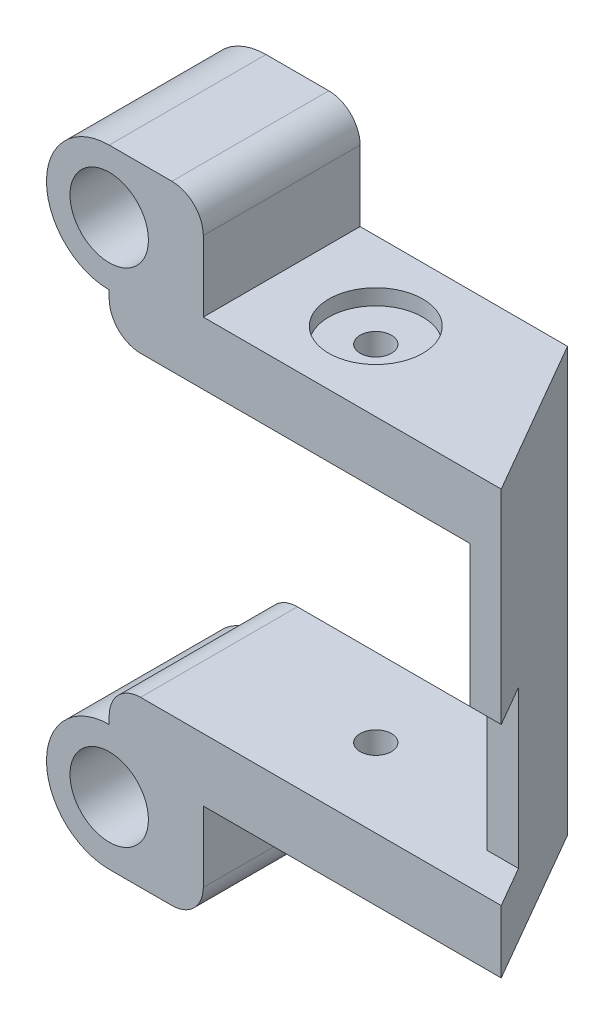
ISO-10303-21;
HEADER;
FILE_DESCRIPTION(('STEP AP214'),'2;1');
FILE_NAME('part.step','',(''),(''),'','','');
FILE_SCHEMA(('AUTOMOTIVE_DESIGN { 1 0 10303 214 1 1 1 1 }'));
ENDSEC;
DATA;
#1=APPLICATION_CONTEXT('core data for automotive mechanical design processes');
#2=APPLICATION_PROTOCOL_DEFINITION('international standard','automotive_design',2000,#1);
#3=PRODUCT_CONTEXT('',#1,'mechanical');
#4=PRODUCT('Part','Part','',(#3));
#5=PRODUCT_RELATED_PRODUCT_CATEGORY('part','',(#4));
#6=PRODUCT_DEFINITION_FORMATION('','',#4);
#7=PRODUCT_DEFINITION_CONTEXT('part definition',#1,'design');
#8=PRODUCT_DEFINITION('design','',#6,#7);
#9=PRODUCT_DEFINITION_SHAPE('','',#8);
#10=(LENGTH_UNIT() NAMED_UNIT(*) SI_UNIT(.MILLI.,.METRE.));
#11=(NAMED_UNIT(*) PLANE_ANGLE_UNIT() SI_UNIT($,.RADIAN.));
#12=(NAMED_UNIT(*) SI_UNIT($,.STERADIAN.) SOLID_ANGLE_UNIT());
#13=UNCERTAINTY_MEASURE_WITH_UNIT(LENGTH_MEASURE(1.E-05),#10,'distance_accuracy_value','');
#14=(GEOMETRIC_REPRESENTATION_CONTEXT(3) GLOBAL_UNCERTAINTY_ASSIGNED_CONTEXT((#13)) GLOBAL_UNIT_ASSIGNED_CONTEXT((#10,
#11,#12)) REPRESENTATION_CONTEXT('',''));
#15=CARTESIAN_POINT('',(0.,0.,0.));
#16=DIRECTION('',(0.,0.,1.));
#17=DIRECTION('',(1.,0.,0.));
#18=AXIS2_PLACEMENT_3D('',#15,#16,#17);
#19=CARTESIAN_POINT('',(-131.23163521819,16.2006515426683,10.));
#20=DIRECTION('',(0.,0.,1.));
#21=DIRECTION('',(1.,0.,0.));
#22=AXIS2_PLACEMENT_3D('',#19,#20,#21);
#23=PLANE('',#22);
#24=DIRECTION('',(-1.,0.,0.));
#25=VECTOR('',#24,1.);
#26=CARTESIAN_POINT('',(-108.23163521819,32.7006515426684,10.));
#27=LINE('',#26,#25);
#28=CARTESIAN_POINT('',(-106.23163521819,32.7006515426684,10.));
#29=VERTEX_POINT('',#28);
#30=CARTESIAN_POINT('',(-108.23163521819,32.7006515426684,10.));
#31=VERTEX_POINT('',#30);
#32=EDGE_CURVE('E192',#29,#31,#27,.T.);
#33=ORIENTED_EDGE('',*,*,#32,.F.);
#34=DIRECTION('',(0.,1.,0.));
#35=VECTOR('',#34,1.);
#36=CARTESIAN_POINT('',(-106.23163521819,22.7006515426684,10.));
#37=LINE('',#36,#35);
#38=CARTESIAN_POINT('',(-106.23163521819,45.7006515426684,9.99999999999999));
#39=VERTEX_POINT('',#38);
#40=EDGE_CURVE('E326',#29,#39,#37,.T.);
#41=ORIENTED_EDGE('',*,*,#40,.T.);
#42=DIRECTION('',(1.,0.,0.));
#43=VECTOR('',#42,1.);
#44=CARTESIAN_POINT('',(-106.23163521819,45.7006515426684,10.));
#45=LINE('',#44,#43);
#46=CARTESIAN_POINT('',(-125.23163521819,45.7006515426684,10.));
#47=VERTEX_POINT('',#46);
#48=EDGE_CURVE('E370',#47,#39,#45,.T.);
#49=ORIENTED_EDGE('',*,*,#48,.F.);
#50=DIRECTION('',(0.,-1.,0.));
#51=VECTOR('',#50,1.);
#52=CARTESIAN_POINT('',(-125.23163521819,45.7006515426684,10.));
#53=LINE('',#52,#51);
#54=CARTESIAN_POINT('',(-125.23163521819,50.2006515426684,10.));
#55=VERTEX_POINT('',#54);
#56=EDGE_CURVE('E367',#55,#47,#53,.T.);
#57=ORIENTED_EDGE('',*,*,#56,.F.);
#58=CARTESIAN_POINT('',(-127.23163521819,50.2006515426684,10.));
#59=DIRECTION('',(0.,0.,-1.));
#60=DIRECTION('',(1.,0.,0.));
#61=AXIS2_PLACEMENT_3D('',#58,#59,#60);
#62=CIRCLE('',#61,2.);
#63=CARTESIAN_POINT('',(-127.23163521819,52.2006515426684,10.));
#64=VERTEX_POINT('',#63);
#65=EDGE_CURVE('E422',#64,#55,#62,.T.);
#66=ORIENTED_EDGE('',*,*,#65,.F.);
#67=DIRECTION('',(1.,0.,0.));
#68=VECTOR('',#67,1.);
#69=CARTESIAN_POINT('',(-125.23163521819,52.2006515426684,10.));
#70=LINE('',#69,#68);
#71=CARTESIAN_POINT('',(-131.23163521819,52.2006515426684,10.));
#72=VERTEX_POINT('',#71);
#73=EDGE_CURVE('E383',#72,#64,#70,.T.);
#74=ORIENTED_EDGE('',*,*,#73,.F.);
#75=CARTESIAN_POINT('',(-131.23163521819,48.2006515426684,10.));
#76=DIRECTION('',(0.,0.,-1.));
#77=DIRECTION('',(1.,0.,0.));
#78=AXIS2_PLACEMENT_3D('',#75,#76,#77);
#79=CIRCLE('',#78,4.);
#80=CARTESIAN_POINT('',(-131.23163521819,44.2006515426684,10.));
#81=VERTEX_POINT('',#80);
#82=EDGE_CURVE('E380',#81,#72,#79,.T.);
#83=ORIENTED_EDGE('',*,*,#82,.F.);
#84=DIRECTION('',(0.,1.,0.));
#85=VECTOR('',#84,1.);
#86=CARTESIAN_POINT('',(-131.23163521819,41.7006515426684,10.));
#87=LINE('',#86,#85);
#88=CARTESIAN_POINT('',(-131.23163521819,43.7006515426684,10.));
#89=VERTEX_POINT('',#88);
#90=EDGE_CURVE('E377',#89,#81,#87,.T.);
#91=ORIENTED_EDGE('',*,*,#90,.F.);
#92=CARTESIAN_POINT('',(-129.23163521819,43.7006515426684,10.));
#93=DIRECTION('',(0.,0.,-1.));
#94=DIRECTION('',(1.,0.,0.));
#95=AXIS2_PLACEMENT_3D('',#92,#93,#94);
#96=CIRCLE('',#95,2.);
#97=CARTESIAN_POINT('',(-129.23163521819,41.7006515426684,10.));
#98=VERTEX_POINT('',#97);
#99=EDGE_CURVE('E425',#98,#89,#96,.T.);
#100=ORIENTED_EDGE('',*,*,#99,.F.);
#101=DIRECTION('',(-1.,0.,0.));
#102=VECTOR('',#101,1.);
#103=CARTESIAN_POINT('',(-106.23163521819,41.7006515426684,10.));
#104=LINE('',#103,#102);
#105=CARTESIAN_POINT('',(-108.23163521819,41.7006515426684,10.));
#106=VERTEX_POINT('',#105);
#107=EDGE_CURVE('E374',#106,#98,#104,.T.);
#108=ORIENTED_EDGE('',*,*,#107,.F.);
#109=DIRECTION('',(0.,-1.,0.));
#110=VECTOR('',#109,1.);
#111=CARTESIAN_POINT('',(-108.23163521819,32.2006515426684,10.));
#112=LINE('',#111,#110);
#113=EDGE_CURVE('E211',#106,#31,#112,.T.);
#114=ORIENTED_EDGE('',*,*,#113,.T.);
#115=EDGE_LOOP('',(#33,#41,#49,#57,#66,#74,#83,#91,#100,#108,#114));
#116=FACE_BOUND('',#115,.T.);
#117=CARTESIAN_POINT('',(-131.23163521819,48.2006515426684,10.));
#118=DIRECTION('',(0.,0.,-1.));
#119=DIRECTION('',(1.,0.,0.));
#120=AXIS2_PLACEMENT_3D('',#117,#118,#119);
#121=CIRCLE('',#120,2.5);
#122=CARTESIAN_POINT('',(-128.73163521819,48.2006515426684,10.));
#123=VERTEX_POINT('',#122);
#124=EDGE_CURVE('E361',#123,#123,#121,.T.);
#125=ORIENTED_EDGE('',*,*,#124,.T.);
#126=EDGE_LOOP('',(#125));
#127=FACE_BOUND('',#126,.T.);
#128=ADVANCED_FACE('F33',(#116,#127),#23,.T.);
#129=CARTESIAN_POINT('',(-119.23163521819,22.7006515426684,5.));
#130=DIRECTION('',(0.,-1.,0.));
#131=DIRECTION('',(0.,0.,-1.));
#132=AXIS2_PLACEMENT_3D('',#129,#130,#131);
#133=CYLINDRICAL_SURFACE('',#132,0.999999999999998);
#134=CARTESIAN_POINT('',(-119.23163521819,22.7006515426684,5.));
#135=DIRECTION('',(0.,-1.,0.));
#136=DIRECTION('',(0.,0.,-1.));
#137=AXIS2_PLACEMENT_3D('',#134,#135,#136);
#138=CIRCLE('',#137,0.999999999999998);
#139=CARTESIAN_POINT('',(-119.23163521819,22.7006515426684,4.));
#140=VERTEX_POINT('',#139);
#141=EDGE_CURVE('E316',#140,#140,#138,.T.);
#142=ORIENTED_EDGE('',*,*,#141,.F.);
#143=EDGE_LOOP('',(#142));
#144=FACE_BOUND('',#143,.T.);
#145=CARTESIAN_POINT('',(-119.23163521819,19.7006515426684,5.));
#146=DIRECTION('',(0.,-1.,0.));
#147=DIRECTION('',(0.,0.,-1.));
#148=AXIS2_PLACEMENT_3D('',#145,#146,#147);
#149=CIRCLE('',#148,0.999999999999998);
#150=CARTESIAN_POINT('',(-119.23163521819,19.7006515426684,4.));
#151=VERTEX_POINT('',#150);
#152=EDGE_CURVE('E209',#151,#151,#149,.F.);
#153=ORIENTED_EDGE('',*,*,#152,.F.);
#154=EDGE_LOOP('',(#153));
#155=FACE_BOUND('',#154,.T.);
#156=ADVANCED_FACE('F286',(#144,#155),#133,.F.);
#157=CARTESIAN_POINT('',(-106.23163521819,18.7006515426684,9.99999999999999));
#158=VERTEX_POINT('',#157);
#159=CARTESIAN_POINT('',(-106.23163521819,22.7006515426684,10.));
#160=VERTEX_POINT('',#159);
#161=EDGE_CURVE('E307',#158,#160,#37,.T.);
#162=ORIENTED_EDGE('',*,*,#161,.T.);
#163=DIRECTION('',(-1.,0.,0.));
#164=VECTOR('',#163,1.);
#165=CARTESIAN_POINT('',(-106.23163521819,22.7006515426684,10.));
#166=LINE('',#165,#164);
#167=CARTESIAN_POINT('',(-129.23163521819,22.7006515426684,10.));
#168=VERTEX_POINT('',#167);
#169=EDGE_CURVE('E328',#160,#168,#166,.T.);
#170=ORIENTED_EDGE('',*,*,#169,.T.);
#171=CARTESIAN_POINT('',(-129.23163521819,20.7006515426684,10.));
#172=DIRECTION('',(0.,0.,1.));
#173=DIRECTION('',(1.,0.,0.));
#174=AXIS2_PLACEMENT_3D('',#171,#172,#173);
#175=CIRCLE('',#174,2.);
#176=CARTESIAN_POINT('',(-131.23163521819,20.7006515426683,10.));
#177=VERTEX_POINT('',#176);
#178=EDGE_CURVE('E220',#168,#177,#175,.T.);
#179=ORIENTED_EDGE('',*,*,#178,.T.);
#180=DIRECTION('',(0.,-1.,0.));
#181=VECTOR('',#180,1.);
#182=CARTESIAN_POINT('',(-131.23163521819,22.7006515426684,10.));
#183=LINE('',#182,#181);
#184=CARTESIAN_POINT('',(-131.23163521819,20.2006515426683,10.));
#185=VERTEX_POINT('',#184);
#186=EDGE_CURVE('E330',#177,#185,#183,.T.);
#187=ORIENTED_EDGE('',*,*,#186,.T.);
#188=CARTESIAN_POINT('',(-131.23163521819,16.2006515426683,10.));
#189=DIRECTION('',(0.,0.,1.));
#190=DIRECTION('',(1.,0.,0.));
#191=AXIS2_PLACEMENT_3D('',#188,#189,#190);
#192=CIRCLE('',#191,4.);
#193=CARTESIAN_POINT('',(-131.23163521819,12.2006515426684,10.));
#194=VERTEX_POINT('',#193);
#195=EDGE_CURVE('E266',#185,#194,#192,.T.);
#196=ORIENTED_EDGE('',*,*,#195,.T.);
#197=DIRECTION('',(1.,0.,0.));
#198=VECTOR('',#197,1.);
#199=CARTESIAN_POINT('',(-125.23163521819,12.2006515426684,10.));
#200=LINE('',#199,#198);
#201=CARTESIAN_POINT('',(-127.23163521819,12.2006515426684,10.));
#202=VERTEX_POINT('',#201);
#203=EDGE_CURVE('E247',#194,#202,#200,.T.);
#204=ORIENTED_EDGE('',*,*,#203,.T.);
#205=CARTESIAN_POINT('',(-127.23163521819,14.2006515426684,10.));
#206=DIRECTION('',(0.,0.,1.));
#207=DIRECTION('',(1.,0.,0.));
#208=AXIS2_PLACEMENT_3D('',#205,#206,#207);
#209=CIRCLE('',#208,2.);
#210=CARTESIAN_POINT('',(-125.23163521819,14.2006515426683,10.));
#211=VERTEX_POINT('',#210);
#212=EDGE_CURVE('E56',#202,#211,#209,.T.);
#213=ORIENTED_EDGE('',*,*,#212,.T.);
#214=DIRECTION('',(0.,1.,0.));
#215=VECTOR('',#214,1.);
#216=CARTESIAN_POINT('',(-125.23163521819,18.7006515426684,10.));
#217=LINE('',#216,#215);
#218=CARTESIAN_POINT('',(-125.23163521819,18.7006515426684,10.));
#219=VERTEX_POINT('',#218);
#220=EDGE_CURVE('E229',#211,#219,#217,.T.);
#221=ORIENTED_EDGE('',*,*,#220,.T.);
#222=DIRECTION('',(1.,0.,0.));
#223=VECTOR('',#222,1.);
#224=CARTESIAN_POINT('',(-106.23163521819,18.7006515426684,10.));
#225=LINE('',#224,#223);
#226=EDGE_CURVE('E324',#219,#158,#225,.T.);
#227=ORIENTED_EDGE('',*,*,#226,.T.);
#228=EDGE_LOOP('',(#162,#170,#179,#187,#196,#204,#213,#221,#227));
#229=FACE_BOUND('',#228,.T.);
#230=CARTESIAN_POINT('',(-131.23163521819,16.2006515426684,10.));
#231=DIRECTION('',(0.,0.,1.));
#232=DIRECTION('',(1.,0.,0.));
#233=AXIS2_PLACEMENT_3D('',#230,#231,#232);
#234=CIRCLE('',#233,2.5);
#235=CARTESIAN_POINT('',(-128.73163521819,16.2006515426684,10.));
#236=VERTEX_POINT('',#235);
#237=EDGE_CURVE('E239',#236,#236,#234,.T.);
#238=ORIENTED_EDGE('',*,*,#237,.F.);
#239=EDGE_LOOP('',(#238));
#240=FACE_BOUND('',#239,.T.);
#241=ADVANCED_FACE('F289',(#229,#240),#23,.T.);
#242=CARTESIAN_POINT('',(-131.23163521819,16.2006515426683,0.));
#243=DIRECTION('',(0.,0.,1.));
#244=DIRECTION('',(1.,0.,0.));
#245=AXIS2_PLACEMENT_3D('',#242,#243,#244);
#246=PLANE('',#245);
#247=DIRECTION('',(0.,-1.,0.));
#248=VECTOR('',#247,1.);
#249=CARTESIAN_POINT('',(-131.23163521819,22.7006515426684,0.));
#250=LINE('',#249,#248);
#251=CARTESIAN_POINT('',(-131.23163521819,20.7006515426683,0.));
#252=VERTEX_POINT('',#251);
#253=CARTESIAN_POINT('',(-131.23163521819,20.2006515426683,0.));
#254=VERTEX_POINT('',#253);
#255=EDGE_CURVE('E251',#252,#254,#250,.T.);
#256=ORIENTED_EDGE('',*,*,#255,.F.);
#257=CARTESIAN_POINT('',(-129.23163521819,20.7006515426684,0.));
#258=DIRECTION('',(0.,0.,1.));
#259=DIRECTION('',(1.,0.,0.));
#260=AXIS2_PLACEMENT_3D('',#257,#258,#259);
#261=CIRCLE('',#260,2.);
#262=CARTESIAN_POINT('',(-129.23163521819,22.7006515426684,0.));
#263=VERTEX_POINT('',#262);
#264=EDGE_CURVE('E215',#252,#263,#261,.F.);
#265=ORIENTED_EDGE('',*,*,#264,.T.);
#266=DIRECTION('',(-1.,0.,0.));
#267=VECTOR('',#266,1.);
#268=CARTESIAN_POINT('',(-106.23163521819,22.7006515426684,0.));
#269=LINE('',#268,#267);
#270=CARTESIAN_POINT('',(-114.005137910086,22.7006515426684,0.));
#271=VERTEX_POINT('',#270);
#272=EDGE_CURVE('E241',#271,#263,#269,.T.);
#273=ORIENTED_EDGE('',*,*,#272,.F.);
#274=DIRECTION('',(0.,-1.,0.));
#275=VECTOR('',#274,1.);
#276=CARTESIAN_POINT('',(-114.005137910086,32.2006515426684,0.));
#277=LINE('',#276,#275);
#278=CARTESIAN_POINT('',(-114.005137910086,41.7006515426684,0.));
#279=VERTEX_POINT('',#278);
#280=EDGE_CURVE('E196',#279,#271,#277,.T.);
#281=ORIENTED_EDGE('',*,*,#280,.F.);
#282=DIRECTION('',(-1.,0.,0.));
#283=VECTOR('',#282,1.);
#284=CARTESIAN_POINT('',(-106.23163521819,41.7006515426684,0.));
#285=LINE('',#284,#283);
#286=CARTESIAN_POINT('',(-129.23163521819,41.7006515426684,0.));
#287=VERTEX_POINT('',#286);
#288=EDGE_CURVE('E392',#279,#287,#285,.T.);
#289=ORIENTED_EDGE('',*,*,#288,.T.);
#290=CARTESIAN_POINT('',(-129.23163521819,43.7006515426684,0.));
#291=DIRECTION('',(0.,0.,-1.));
#292=DIRECTION('',(1.,0.,0.));
#293=AXIS2_PLACEMENT_3D('',#290,#291,#292);
#294=CIRCLE('',#293,2.);
#295=CARTESIAN_POINT('',(-131.23163521819,43.7006515426684,0.));
#296=VERTEX_POINT('',#295);
#297=EDGE_CURVE('E417',#296,#287,#294,.F.);
#298=ORIENTED_EDGE('',*,*,#297,.F.);
#299=DIRECTION('',(0.,1.,0.));
#300=VECTOR('',#299,1.);
#301=CARTESIAN_POINT('',(-131.23163521819,41.7006515426684,0.));
#302=LINE('',#301,#300);
#303=CARTESIAN_POINT('',(-131.23163521819,44.2006515426684,0.));
#304=VERTEX_POINT('',#303);
#305=EDGE_CURVE('E395',#296,#304,#302,.T.);
#306=ORIENTED_EDGE('',*,*,#305,.T.);
#307=CARTESIAN_POINT('',(-131.23163521819,48.2006515426684,0.));
#308=DIRECTION('',(0.,0.,-1.));
#309=DIRECTION('',(1.,0.,0.));
#310=AXIS2_PLACEMENT_3D('',#307,#308,#309);
#311=CIRCLE('',#310,4.);
#312=CARTESIAN_POINT('',(-131.23163521819,52.2006515426684,0.));
#313=VERTEX_POINT('',#312);
#314=EDGE_CURVE('E398',#304,#313,#311,.T.);
#315=ORIENTED_EDGE('',*,*,#314,.T.);
#316=DIRECTION('',(1.,0.,0.));
#317=VECTOR('',#316,1.);
#318=CARTESIAN_POINT('',(-125.23163521819,52.2006515426684,0.));
#319=LINE('',#318,#317);
#320=CARTESIAN_POINT('',(-127.23163521819,52.2006515426684,0.));
#321=VERTEX_POINT('',#320);
#322=EDGE_CURVE('E371',#313,#321,#319,.T.);
#323=ORIENTED_EDGE('',*,*,#322,.T.);
#324=CARTESIAN_POINT('',(-127.23163521819,50.2006515426684,0.));
#325=DIRECTION('',(0.,0.,-1.));
#326=DIRECTION('',(1.,0.,0.));
#327=AXIS2_PLACEMENT_3D('',#324,#325,#326);
#328=CIRCLE('',#327,2.);
#329=CARTESIAN_POINT('',(-125.23163521819,50.2006515426684,0.));
#330=VERTEX_POINT('',#329);
#331=EDGE_CURVE('E414',#330,#321,#328,.F.);
#332=ORIENTED_EDGE('',*,*,#331,.F.);
#333=DIRECTION('',(0.,-1.,0.));
#334=VECTOR('',#333,1.);
#335=CARTESIAN_POINT('',(-125.23163521819,45.7006515426684,0.));
#336=LINE('',#335,#334);
#337=CARTESIAN_POINT('',(-125.23163521819,45.7006515426684,0.));
#338=VERTEX_POINT('',#337);
#339=EDGE_CURVE('E364',#330,#338,#336,.T.);
#340=ORIENTED_EDGE('',*,*,#339,.T.);
#341=DIRECTION('',(1.,0.,0.));
#342=VECTOR('',#341,1.);
#343=CARTESIAN_POINT('',(-106.23163521819,45.7006515426684,0.));
#344=LINE('',#343,#342);
#345=CARTESIAN_POINT('',(-112.005137910086,45.7006515426684,0.));
#346=VERTEX_POINT('',#345);
#347=EDGE_CURVE('E389',#338,#346,#344,.T.);
#348=ORIENTED_EDGE('',*,*,#347,.T.);
#349=DIRECTION('',(0.,-1.,0.));
#350=VECTOR('',#349,1.);
#351=CARTESIAN_POINT('',(-112.005137910086,22.7006515426684,0.));
#352=LINE('',#351,#350);
#353=CARTESIAN_POINT('',(-112.005137910086,18.7006515426684,0.));
#354=VERTEX_POINT('',#353);
#355=EDGE_CURVE('E319',#346,#354,#352,.T.);
#356=ORIENTED_EDGE('',*,*,#355,.T.);
#357=DIRECTION('',(1.,0.,0.));
#358=VECTOR('',#357,1.);
#359=CARTESIAN_POINT('',(-106.23163521819,18.7006515426684,0.));
#360=LINE('',#359,#358);
#361=CARTESIAN_POINT('',(-125.23163521819,18.7006515426684,0.));
#362=VERTEX_POINT('',#361);
#363=EDGE_CURVE('E238',#362,#354,#360,.T.);
#364=ORIENTED_EDGE('',*,*,#363,.F.);
#365=DIRECTION('',(0.,1.,0.));
#366=VECTOR('',#365,1.);
#367=CARTESIAN_POINT('',(-125.23163521819,18.7006515426684,0.));
#368=LINE('',#367,#366);
#369=CARTESIAN_POINT('',(-125.23163521819,14.2006515426683,0.));
#370=VERTEX_POINT('',#369);
#371=EDGE_CURVE('E227',#370,#362,#368,.T.);
#372=ORIENTED_EDGE('',*,*,#371,.F.);
#373=CARTESIAN_POINT('',(-127.23163521819,14.2006515426684,0.));
#374=DIRECTION('',(0.,0.,1.));
#375=DIRECTION('',(1.,0.,0.));
#376=AXIS2_PLACEMENT_3D('',#373,#374,#375);
#377=CIRCLE('',#376,2.);
#378=CARTESIAN_POINT('',(-127.23163521819,12.2006515426684,0.));
#379=VERTEX_POINT('',#378);
#380=EDGE_CURVE('E202',#370,#379,#377,.F.);
#381=ORIENTED_EDGE('',*,*,#380,.T.);
#382=DIRECTION('',(1.,0.,0.));
#383=VECTOR('',#382,1.);
#384=CARTESIAN_POINT('',(-125.23163521819,12.2006515426684,0.));
#385=LINE('',#384,#383);
#386=CARTESIAN_POINT('',(-131.23163521819,12.2006515426684,0.));
#387=VERTEX_POINT('',#386);
#388=EDGE_CURVE('E255',#387,#379,#385,.T.);
#389=ORIENTED_EDGE('',*,*,#388,.F.);
#390=CARTESIAN_POINT('',(-131.23163521819,16.2006515426683,0.));
#391=DIRECTION('',(0.,0.,1.));
#392=DIRECTION('',(1.,0.,0.));
#393=AXIS2_PLACEMENT_3D('',#390,#391,#392);
#394=CIRCLE('',#393,4.);
#395=EDGE_CURVE('E253',#254,#387,#394,.T.);
#396=ORIENTED_EDGE('',*,*,#395,.F.);
#397=EDGE_LOOP('',(#256,#265,#273,#281,#289,#298,#306,#315,#323,#332,#340,#348,#356,#364,#372,
#381,#389,#396));
#398=FACE_BOUND('',#397,.T.);
#399=CARTESIAN_POINT('',(-131.23163521819,16.2006515426684,0.));
#400=DIRECTION('',(0.,0.,1.));
#401=DIRECTION('',(1.,0.,0.));
#402=AXIS2_PLACEMENT_3D('',#399,#400,#401);
#403=CIRCLE('',#402,2.5);
#404=CARTESIAN_POINT('',(-128.73163521819,16.2006515426684,0.));
#405=VERTEX_POINT('',#404);
#406=EDGE_CURVE('E244',#405,#405,#403,.T.);
#407=ORIENTED_EDGE('',*,*,#406,.T.);
#408=EDGE_LOOP('',(#407));
#409=FACE_BOUND('',#408,.T.);
#410=CARTESIAN_POINT('',(-131.23163521819,48.2006515426684,0.));
#411=DIRECTION('',(0.,0.,-1.));
#412=DIRECTION('',(1.,0.,0.));
#413=AXIS2_PLACEMENT_3D('',#410,#411,#412);
#414=CIRCLE('',#413,2.5);
#415=CARTESIAN_POINT('',(-128.73163521819,48.2006515426684,0.));
#416=VERTEX_POINT('',#415);
#417=EDGE_CURVE('E357',#416,#416,#414,.T.);
#418=ORIENTED_EDGE('',*,*,#417,.F.);
#419=EDGE_LOOP('',(#418));
#420=FACE_BOUND('',#419,.T.);
#421=ADVANCED_FACE('F233',(#398,#409,#420),#246,.F.);
#422=CARTESIAN_POINT('',(-125.23163521819,18.7006515426684,10.));
#423=DIRECTION('',(-1.,0.,0.));
#424=DIRECTION('',(0.,-1.,0.));
#425=AXIS2_PLACEMENT_3D('',#422,#423,#424);
#426=PLANE('',#425);
#427=ORIENTED_EDGE('',*,*,#220,.F.);
#428=DIRECTION('',(0.,0.,-1.));
#429=VECTOR('',#428,1.);
#430=CARTESIAN_POINT('',(-125.23163521819,14.2006515426683,10.));
#431=LINE('',#430,#429);
#432=EDGE_CURVE('E41',#211,#370,#431,.T.);
#433=ORIENTED_EDGE('',*,*,#432,.T.);
#434=ORIENTED_EDGE('',*,*,#371,.T.);
#435=DIRECTION('',(0.,0.,-1.));
#436=VECTOR('',#435,1.);
#437=CARTESIAN_POINT('',(-125.23163521819,18.7006515426684,10.));
#438=LINE('',#437,#436);
#439=EDGE_CURVE('E199',#219,#362,#438,.T.);
#440=ORIENTED_EDGE('',*,*,#439,.F.);
#441=EDGE_LOOP('',(#427,#433,#434,#440));
#442=FACE_BOUND('',#441,.T.);
#443=ADVANCED_FACE('F225',(#442),#426,.F.);
#444=CARTESIAN_POINT('',(-106.23163521819,18.7006515426684,10.));
#445=DIRECTION('',(0.,1.,0.));
#446=DIRECTION('',(0.,0.,1.));
#447=AXIS2_PLACEMENT_3D('',#444,#445,#446);
#448=PLANE('',#447);
#449=CARTESIAN_POINT('',(-119.23163521819,18.7006515426684,5.));
#450=DIRECTION('',(0.,-1.,0.));
#451=DIRECTION('',(0.,0.,-1.));
#452=AXIS2_PLACEMENT_3D('',#449,#450,#451);
#453=CIRCLE('',#452,3.00000000000001);
#454=CARTESIAN_POINT('',(-119.23163521819,18.7006515426684,1.99999999999999));
#455=VERTEX_POINT('',#454);
#456=EDGE_CURVE('E432',#455,#455,#453,.T.);
#457=ORIENTED_EDGE('',*,*,#456,.F.);
#458=EDGE_LOOP('',(#457));
#459=FACE_BOUND('',#458,.T.);
#460=ORIENTED_EDGE('',*,*,#363,.T.);
#461=DIRECTION('',(-0.499999999999995,0.,-0.866025403784442));
#462=VECTOR('',#461,1.);
#463=CARTESIAN_POINT('',(-106.23163521819,18.7006515426684,9.99999999999999));
#464=LINE('',#463,#462);
#465=EDGE_CURVE('E438',#158,#354,#464,.T.);
#466=ORIENTED_EDGE('',*,*,#465,.F.);
#467=ORIENTED_EDGE('',*,*,#226,.F.);
#468=ORIENTED_EDGE('',*,*,#439,.T.);
#469=EDGE_LOOP('',(#460,#466,#467,#468));
#470=FACE_BOUND('',#469,.T.);
#471=ADVANCED_FACE('F671',(#459,#470),#448,.F.);
#472=CARTESIAN_POINT('',(-106.23163521819,22.7006515426684,10.));
#473=DIRECTION('',(0.,-1.,0.));
#474=DIRECTION('',(0.,0.,-1.));
#475=AXIS2_PLACEMENT_3D('',#472,#473,#474);
#476=PLANE('',#475);
#477=ORIENTED_EDGE('',*,*,#141,.T.);
#478=EDGE_LOOP('',(#477));
#479=FACE_BOUND('',#478,.T.);
#480=ORIENTED_EDGE('',*,*,#272,.T.);
#481=DIRECTION('',(0.,0.,-1.));
#482=VECTOR('',#481,1.);
#483=CARTESIAN_POINT('',(-129.23163521819,22.7006515426684,10.));
#484=LINE('',#483,#482);
#485=EDGE_CURVE('E217',#263,#168,#484,.F.);
#486=ORIENTED_EDGE('',*,*,#485,.T.);
#487=ORIENTED_EDGE('',*,*,#169,.F.);
#488=DIRECTION('',(0.499999999999995,0.,0.866025403784441));
#489=VECTOR('',#488,1.);
#490=CARTESIAN_POINT('',(-107.73163521819,22.7006515426684,7.40192378864668));
#491=LINE('',#490,#489);
#492=CARTESIAN_POINT('',(-107.73163521819,22.7006515426684,7.40192378864668));
#493=VERTEX_POINT('',#492);
#494=EDGE_CURVE('E183',#493,#160,#491,.T.);
#495=ORIENTED_EDGE('',*,*,#494,.F.);
#496=DIRECTION('',(1.,0.,0.));
#497=VECTOR('',#496,1.);
#498=CARTESIAN_POINT('',(-109.73163521819,22.7006515426684,7.40192378864668));
#499=LINE('',#498,#497);
#500=CARTESIAN_POINT('',(-109.73163521819,22.7006515426684,7.40192378864668));
#501=VERTEX_POINT('',#500);
#502=EDGE_CURVE('E176',#501,#493,#499,.T.);
#503=ORIENTED_EDGE('',*,*,#502,.F.);
#504=DIRECTION('',(-0.499999999999995,0.,-0.866025403784442));
#505=VECTOR('',#504,1.);
#506=CARTESIAN_POINT('',(-107.73163521819,22.7006515426684,10.8660254037844));
#507=LINE('',#506,#505);
#508=EDGE_CURVE('E180',#501,#271,#507,.T.);
#509=ORIENTED_EDGE('',*,*,#508,.T.);
#510=EDGE_LOOP('',(#480,#486,#487,#495,#503,#509));
#511=FACE_BOUND('',#510,.T.);
#512=ADVANCED_FACE('F178',(#479,#511),#476,.F.);
#513=CARTESIAN_POINT('',(-131.23163521819,22.7006515426684,10.));
#514=DIRECTION('',(1.,0.,0.));
#515=DIRECTION('',(0.,1.,0.));
#516=AXIS2_PLACEMENT_3D('',#513,#514,#515);
#517=PLANE('',#516);
#518=ORIENTED_EDGE('',*,*,#186,.F.);
#519=DIRECTION('',(0.,0.,-1.));
#520=VECTOR('',#519,1.);
#521=CARTESIAN_POINT('',(-131.23163521819,20.7006515426683,10.));
#522=LINE('',#521,#520);
#523=EDGE_CURVE('E198',#177,#252,#522,.T.);
#524=ORIENTED_EDGE('',*,*,#523,.T.);
#525=ORIENTED_EDGE('',*,*,#255,.T.);
#526=DIRECTION('',(0.,0.,-1.));
#527=VECTOR('',#526,1.);
#528=CARTESIAN_POINT('',(-131.23163521819,20.2006515426683,10.));
#529=LINE('',#528,#527);
#530=EDGE_CURVE('E205',#185,#254,#529,.T.);
#531=ORIENTED_EDGE('',*,*,#530,.F.);
#532=EDGE_LOOP('',(#518,#524,#525,#531));
#533=FACE_BOUND('',#532,.T.);
#534=ADVANCED_FACE('F333',(#533),#517,.F.);
#535=CARTESIAN_POINT('',(-131.23163521819,16.2006515426683,10.));
#536=DIRECTION('',(0.,0.,-1.));
#537=DIRECTION('',(-1.,0.,0.));
#538=AXIS2_PLACEMENT_3D('',#535,#536,#537);
#539=CYLINDRICAL_SURFACE('',#538,4.);
#540=ORIENTED_EDGE('',*,*,#395,.T.);
#541=DIRECTION('',(0.,0.,-1.));
#542=VECTOR('',#541,1.);
#543=CARTESIAN_POINT('',(-131.23163521819,12.2006515426684,10.));
#544=LINE('',#543,#542);
#545=EDGE_CURVE('E257',#194,#387,#544,.T.);
#546=ORIENTED_EDGE('',*,*,#545,.F.);
#547=ORIENTED_EDGE('',*,*,#195,.F.);
#548=ORIENTED_EDGE('',*,*,#530,.T.);
#549=EDGE_LOOP('',(#540,#546,#547,#548));
#550=FACE_BOUND('',#549,.T.);
#551=ADVANCED_FACE('F264',(#550),#539,.T.);
#552=CARTESIAN_POINT('',(-125.23163521819,12.2006515426684,10.));
#553=DIRECTION('',(0.,1.,0.));
#554=DIRECTION('',(0.,0.,1.));
#555=AXIS2_PLACEMENT_3D('',#552,#553,#554);
#556=PLANE('',#555);
#557=ORIENTED_EDGE('',*,*,#388,.T.);
#558=DIRECTION('',(0.,0.,-1.));
#559=VECTOR('',#558,1.);
#560=CARTESIAN_POINT('',(-127.23163521819,12.2006515426684,10.));
#561=LINE('',#560,#559);
#562=EDGE_CURVE('E11',#379,#202,#561,.F.);
#563=ORIENTED_EDGE('',*,*,#562,.T.);
#564=ORIENTED_EDGE('',*,*,#203,.F.);
#565=ORIENTED_EDGE('',*,*,#545,.T.);
#566=EDGE_LOOP('',(#557,#563,#564,#565));
#567=FACE_BOUND('',#566,.T.);
#568=ADVANCED_FACE('F271',(#567),#556,.F.);
#569=CARTESIAN_POINT('',(-131.23163521819,16.2006515426684,10.));
#570=DIRECTION('',(0.,0.,-1.));
#571=DIRECTION('',(-1.,0.,0.));
#572=AXIS2_PLACEMENT_3D('',#569,#570,#571);
#573=CYLINDRICAL_SURFACE('',#572,2.5);
#574=ORIENTED_EDGE('',*,*,#237,.T.);
#575=EDGE_LOOP('',(#574));
#576=FACE_BOUND('',#575,.T.);
#577=ORIENTED_EDGE('',*,*,#406,.F.);
#578=EDGE_LOOP('',(#577));
#579=FACE_BOUND('',#578,.T.);
#580=ADVANCED_FACE('F310',(#576,#579),#573,.F.);
#581=CARTESIAN_POINT('',(-106.23163521819,22.7006515426684,9.99999999999999));
#582=DIRECTION('',(-0.866025403784442,0.,0.499999999999995));
#583=DIRECTION('',(0.499999999999995,0.,0.866025403784442));
#584=AXIS2_PLACEMENT_3D('',#581,#582,#583);
#585=PLANE('',#584);
#586=ORIENTED_EDGE('',*,*,#40,.F.);
#587=DIRECTION('',(0.499999999999995,0.,0.866025403784441));
#588=VECTOR('',#587,1.);
#589=CARTESIAN_POINT('',(-107.73163521819,32.7006515426684,7.40192378864668));
#590=LINE('',#589,#588);
#591=CARTESIAN_POINT('',(-107.73163521819,32.7006515426684,7.40192378864668));
#592=VERTEX_POINT('',#591);
#593=EDGE_CURVE('E340',#592,#29,#590,.T.);
#594=ORIENTED_EDGE('',*,*,#593,.F.);
#595=DIRECTION('',(0.,1.,0.));
#596=VECTOR('',#595,1.);
#597=CARTESIAN_POINT('',(-107.73163521819,22.7006515426684,7.40192378864668));
#598=LINE('',#597,#596);
#599=EDGE_CURVE('E185',#493,#592,#598,.T.);
#600=ORIENTED_EDGE('',*,*,#599,.F.);
#601=ORIENTED_EDGE('',*,*,#494,.T.);
#602=ORIENTED_EDGE('',*,*,#161,.F.);
#603=ORIENTED_EDGE('',*,*,#465,.T.);
#604=ORIENTED_EDGE('',*,*,#355,.F.);
#605=DIRECTION('',(-0.499999999999995,0.,-0.866025403784442));
#606=VECTOR('',#605,1.);
#607=CARTESIAN_POINT('',(-106.23163521819,45.7006515426684,9.99999999999999));
#608=LINE('',#607,#606);
#609=EDGE_CURVE('E358',#39,#346,#608,.T.);
#610=ORIENTED_EDGE('',*,*,#609,.F.);
#611=EDGE_LOOP('',(#586,#594,#600,#601,#602,#603,#604,#610));
#612=FACE_BOUND('',#611,.T.);
#613=ADVANCED_FACE('F313',(#612),#585,.F.);
#614=CARTESIAN_POINT('',(-108.23163521819,32.2006515426684,10.));
#615=DIRECTION('',(-0.866025403784442,0.,0.499999999999995));
#616=DIRECTION('',(0.499999999999995,0.,0.866025403784442));
#617=AXIS2_PLACEMENT_3D('',#614,#615,#616);
#618=PLANE('',#617);
#619=DIRECTION('',(0.499999999999995,0.,0.866025403784441));
#620=VECTOR('',#619,1.);
#621=CARTESIAN_POINT('',(-109.73163521819,32.7006515426684,7.40192378864668));
#622=LINE('',#621,#620);
#623=CARTESIAN_POINT('',(-109.73163521819,32.7006515426684,7.40192378864668));
#624=VERTEX_POINT('',#623);
#625=EDGE_CURVE('E342',#624,#31,#622,.T.);
#626=ORIENTED_EDGE('',*,*,#625,.T.);
#627=ORIENTED_EDGE('',*,*,#113,.F.);
#628=DIRECTION('',(-0.499999999999995,0.,-0.866025403784442));
#629=VECTOR('',#628,1.);
#630=CARTESIAN_POINT('',(-107.73163521819,41.7006515426684,10.8660254037844));
#631=LINE('',#630,#629);
#632=EDGE_CURVE('E408',#106,#279,#631,.T.);
#633=ORIENTED_EDGE('',*,*,#632,.T.);
#634=ORIENTED_EDGE('',*,*,#280,.T.);
#635=ORIENTED_EDGE('',*,*,#508,.F.);
#636=DIRECTION('',(0.,-1.,0.));
#637=VECTOR('',#636,1.);
#638=CARTESIAN_POINT('',(-109.73163521819,22.7006515426684,7.40192378864668));
#639=LINE('',#638,#637);
#640=EDGE_CURVE('E186',#624,#501,#639,.T.);
#641=ORIENTED_EDGE('',*,*,#640,.F.);
#642=EDGE_LOOP('',(#626,#627,#633,#634,#635,#641));
#643=FACE_BOUND('',#642,.T.);
#644=ADVANCED_FACE('F194',(#643),#618,.T.);
#645=CARTESIAN_POINT('',(-119.23163521819,19.7006515426684,5.));
#646=DIRECTION('',(0.,-1.,0.));
#647=DIRECTION('',(0.,0.,-1.));
#648=AXIS2_PLACEMENT_3D('',#645,#646,#647);
#649=PLANE('',#648);
#650=CARTESIAN_POINT('',(-119.23163521819,19.7006515426684,5.));
#651=DIRECTION('',(0.,-1.,0.));
#652=DIRECTION('',(0.,0.,-1.));
#653=AXIS2_PLACEMENT_3D('',#650,#651,#652);
#654=CIRCLE('',#653,3.00000000000001);
#655=CARTESIAN_POINT('',(-119.23163521819,19.7006515426684,1.99999999999999));
#656=VERTEX_POINT('',#655);
#657=EDGE_CURVE('E212',#656,#656,#654,.T.);
#658=ORIENTED_EDGE('',*,*,#657,.T.);
#659=EDGE_LOOP('',(#658));
#660=FACE_BOUND('',#659,.T.);
#661=ORIENTED_EDGE('',*,*,#152,.T.);
#662=EDGE_LOOP('',(#661));
#663=FACE_BOUND('',#662,.T.);
#664=ADVANCED_FACE('F492',(#660,#663),#649,.T.);
#665=CARTESIAN_POINT('',(-119.23163521819,19.7006515426684,5.));
#666=DIRECTION('',(0.,-1.,0.));
#667=DIRECTION('',(0.,0.,-1.));
#668=AXIS2_PLACEMENT_3D('',#665,#666,#667);
#669=CYLINDRICAL_SURFACE('',#668,3.00000000000001);
#670=ORIENTED_EDGE('',*,*,#657,.F.);
#671=EDGE_LOOP('',(#670));
#672=FACE_BOUND('',#671,.T.);
#673=ORIENTED_EDGE('',*,*,#456,.T.);
#674=EDGE_LOOP('',(#673));
#675=FACE_BOUND('',#674,.T.);
#676=ADVANCED_FACE('F283',(#672,#675),#669,.F.);
#677=CARTESIAN_POINT('',(-129.23163521819,20.7006515426684,10.));
#678=DIRECTION('',(0.,0.,-1.));
#679=DIRECTION('',(-1.,0.,0.));
#680=AXIS2_PLACEMENT_3D('',#677,#678,#679);
#681=CYLINDRICAL_SURFACE('',#680,2.);
#682=ORIENTED_EDGE('',*,*,#178,.F.);
#683=ORIENTED_EDGE('',*,*,#485,.F.);
#684=ORIENTED_EDGE('',*,*,#264,.F.);
#685=ORIENTED_EDGE('',*,*,#523,.F.);
#686=EDGE_LOOP('',(#682,#683,#684,#685));
#687=FACE_BOUND('',#686,.T.);
#688=ADVANCED_FACE('F275',(#687),#681,.T.);
#689=CARTESIAN_POINT('',(-127.23163521819,14.2006515426684,10.));
#690=DIRECTION('',(0.,0.,-1.));
#691=DIRECTION('',(-1.,0.,0.));
#692=AXIS2_PLACEMENT_3D('',#689,#690,#691);
#693=CYLINDRICAL_SURFACE('',#692,2.);
#694=ORIENTED_EDGE('',*,*,#212,.F.);
#695=ORIENTED_EDGE('',*,*,#562,.F.);
#696=ORIENTED_EDGE('',*,*,#380,.F.);
#697=ORIENTED_EDGE('',*,*,#432,.F.);
#698=EDGE_LOOP('',(#694,#695,#696,#697));
#699=FACE_BOUND('',#698,.T.);
#700=ADVANCED_FACE('F35',(#699),#693,.T.);
#701=CARTESIAN_POINT('',(-119.23163521819,41.7006515426684,5.));
#702=DIRECTION('',(0.,1.,0.));
#703=DIRECTION('',(0.,0.,-1.));
#704=AXIS2_PLACEMENT_3D('',#701,#702,#703);
#705=CYLINDRICAL_SURFACE('',#704,0.999999999999998);
#706=CARTESIAN_POINT('',(-119.23163521819,41.7006515426684,5.));
#707=DIRECTION('',(0.,-1.,0.));
#708=DIRECTION('',(0.,0.,-1.));
#709=AXIS2_PLACEMENT_3D('',#706,#707,#708);
#710=CIRCLE('',#709,0.999999999999998);
#711=CARTESIAN_POINT('',(-119.23163521819,41.7006515426684,4.));
#712=VERTEX_POINT('',#711);
#713=EDGE_CURVE('E354',#712,#712,#710,.T.);
#714=ORIENTED_EDGE('',*,*,#713,.T.);
#715=EDGE_LOOP('',(#714));
#716=FACE_BOUND('',#715,.T.);
#717=CARTESIAN_POINT('',(-119.23163521819,44.7006515426684,5.));
#718=DIRECTION('',(0.,-1.,0.));
#719=DIRECTION('',(0.,0.,-1.));
#720=AXIS2_PLACEMENT_3D('',#717,#718,#719);
#721=CIRCLE('',#720,0.999999999999998);
#722=CARTESIAN_POINT('',(-119.23163521819,44.7006515426684,4.));
#723=VERTEX_POINT('',#722);
#724=EDGE_CURVE('E350',#723,#723,#721,.F.);
#725=ORIENTED_EDGE('',*,*,#724,.T.);
#726=EDGE_LOOP('',(#725));
#727=FACE_BOUND('',#726,.T.);
#728=ADVANCED_FACE('F274',(#716,#727),#705,.F.);
#729=CARTESIAN_POINT('',(-125.23163521819,45.7006515426684,10.));
#730=DIRECTION('',(-1.,0.,0.));
#731=DIRECTION('',(0.,1.,0.));
#732=AXIS2_PLACEMENT_3D('',#729,#730,#731);
#733=PLANE('',#732);
#734=ORIENTED_EDGE('',*,*,#56,.T.);
#735=DIRECTION('',(0.,0.,-1.));
#736=VECTOR('',#735,1.);
#737=CARTESIAN_POINT('',(-125.23163521819,45.7006515426684,10.));
#738=LINE('',#737,#736);
#739=EDGE_CURVE('E406',#47,#338,#738,.T.);
#740=ORIENTED_EDGE('',*,*,#739,.T.);
#741=ORIENTED_EDGE('',*,*,#339,.F.);
#742=DIRECTION('',(0.,0.,-1.));
#743=VECTOR('',#742,1.);
#744=CARTESIAN_POINT('',(-125.23163521819,50.2006515426684,10.));
#745=LINE('',#744,#743);
#746=EDGE_CURVE('E428',#55,#330,#745,.T.);
#747=ORIENTED_EDGE('',*,*,#746,.F.);
#748=EDGE_LOOP('',(#734,#740,#741,#747));
#749=FACE_BOUND('',#748,.T.);
#750=ADVANCED_FACE('F280',(#749),#733,.F.);
#751=CARTESIAN_POINT('',(-106.23163521819,45.7006515426684,10.));
#752=DIRECTION('',(0.,-1.,0.));
#753=DIRECTION('',(0.,0.,1.));
#754=AXIS2_PLACEMENT_3D('',#751,#752,#753);
#755=PLANE('',#754);
#756=CARTESIAN_POINT('',(-119.23163521819,45.7006515426684,5.));
#757=DIRECTION('',(0.,-1.,0.));
#758=DIRECTION('',(0.,0.,-1.));
#759=AXIS2_PLACEMENT_3D('',#756,#757,#758);
#760=CIRCLE('',#759,3.00000000000001);
#761=CARTESIAN_POINT('',(-119.23163521819,45.7006515426684,1.99999999999999));
#762=VERTEX_POINT('',#761);
#763=EDGE_CURVE('E351',#762,#762,#760,.T.);
#764=ORIENTED_EDGE('',*,*,#763,.T.);
#765=EDGE_LOOP('',(#764));
#766=FACE_BOUND('',#765,.T.);
#767=ORIENTED_EDGE('',*,*,#347,.F.);
#768=ORIENTED_EDGE('',*,*,#739,.F.);
#769=ORIENTED_EDGE('',*,*,#48,.T.);
#770=ORIENTED_EDGE('',*,*,#609,.T.);
#771=EDGE_LOOP('',(#767,#768,#769,#770));
#772=FACE_BOUND('',#771,.T.);
#773=ADVANCED_FACE('F444',(#766,#772),#755,.F.);
#774=CARTESIAN_POINT('',(-106.23163521819,41.7006515426684,10.));
#775=DIRECTION('',(0.,1.,0.));
#776=DIRECTION('',(0.,0.,-1.));
#777=AXIS2_PLACEMENT_3D('',#774,#775,#776);
#778=PLANE('',#777);
#779=ORIENTED_EDGE('',*,*,#713,.F.);
#780=EDGE_LOOP('',(#779));
#781=FACE_BOUND('',#780,.T.);
#782=ORIENTED_EDGE('',*,*,#288,.F.);
#783=ORIENTED_EDGE('',*,*,#632,.F.);
#784=ORIENTED_EDGE('',*,*,#107,.T.);
#785=DIRECTION('',(0.,0.,-1.));
#786=VECTOR('',#785,1.);
#787=CARTESIAN_POINT('',(-129.23163521819,41.7006515426684,10.));
#788=LINE('',#787,#786);
#789=EDGE_CURVE('E420',#287,#98,#788,.F.);
#790=ORIENTED_EDGE('',*,*,#789,.F.);
#791=EDGE_LOOP('',(#782,#783,#784,#790));
#792=FACE_BOUND('',#791,.T.);
#793=ADVANCED_FACE('F458',(#781,#792),#778,.F.);
#794=CARTESIAN_POINT('',(-131.23163521819,41.7006515426684,10.));
#795=DIRECTION('',(1.,0.,0.));
#796=DIRECTION('',(0.,-1.,0.));
#797=AXIS2_PLACEMENT_3D('',#794,#795,#796);
#798=PLANE('',#797);
#799=ORIENTED_EDGE('',*,*,#90,.T.);
#800=DIRECTION('',(0.,0.,-1.));
#801=VECTOR('',#800,1.);
#802=CARTESIAN_POINT('',(-131.23163521819,44.2006515426684,10.));
#803=LINE('',#802,#801);
#804=EDGE_CURVE('E404',#81,#304,#803,.T.);
#805=ORIENTED_EDGE('',*,*,#804,.T.);
#806=ORIENTED_EDGE('',*,*,#305,.F.);
#807=DIRECTION('',(0.,0.,-1.));
#808=VECTOR('',#807,1.);
#809=CARTESIAN_POINT('',(-131.23163521819,43.7006515426684,10.));
#810=LINE('',#809,#808);
#811=EDGE_CURVE('E410',#89,#296,#810,.T.);
#812=ORIENTED_EDGE('',*,*,#811,.F.);
#813=EDGE_LOOP('',(#799,#805,#806,#812));
#814=FACE_BOUND('',#813,.T.);
#815=ADVANCED_FACE('F463',(#814),#798,.F.);
#816=CARTESIAN_POINT('',(-131.23163521819,48.2006515426684,10.));
#817=DIRECTION('',(0.,0.,-1.));
#818=DIRECTION('',(-1.,0.,0.));
#819=AXIS2_PLACEMENT_3D('',#816,#817,#818);
#820=CYLINDRICAL_SURFACE('',#819,4.);
#821=ORIENTED_EDGE('',*,*,#314,.F.);
#822=ORIENTED_EDGE('',*,*,#804,.F.);
#823=ORIENTED_EDGE('',*,*,#82,.T.);
#824=DIRECTION('',(0.,0.,-1.));
#825=VECTOR('',#824,1.);
#826=CARTESIAN_POINT('',(-131.23163521819,52.2006515426684,10.));
#827=LINE('',#826,#825);
#828=EDGE_CURVE('E386',#72,#313,#827,.T.);
#829=ORIENTED_EDGE('',*,*,#828,.T.);
#830=EDGE_LOOP('',(#821,#822,#823,#829));
#831=FACE_BOUND('',#830,.T.);
#832=ADVANCED_FACE('F467',(#831),#820,.T.);
#833=CARTESIAN_POINT('',(-125.23163521819,52.2006515426684,10.));
#834=DIRECTION('',(0.,-1.,0.));
#835=DIRECTION('',(0.,0.,1.));
#836=AXIS2_PLACEMENT_3D('',#833,#834,#835);
#837=PLANE('',#836);
#838=ORIENTED_EDGE('',*,*,#322,.F.);
#839=ORIENTED_EDGE('',*,*,#828,.F.);
#840=ORIENTED_EDGE('',*,*,#73,.T.);
#841=DIRECTION('',(0.,0.,-1.));
#842=VECTOR('',#841,1.);
#843=CARTESIAN_POINT('',(-127.23163521819,52.2006515426684,10.));
#844=LINE('',#843,#842);
#845=EDGE_CURVE('E430',#321,#64,#844,.F.);
#846=ORIENTED_EDGE('',*,*,#845,.F.);
#847=EDGE_LOOP('',(#838,#839,#840,#846));
#848=FACE_BOUND('',#847,.T.);
#849=ADVANCED_FACE('F471',(#848),#837,.F.);
#850=CARTESIAN_POINT('',(-131.23163521819,48.2006515426684,10.));
#851=DIRECTION('',(0.,0.,-1.));
#852=DIRECTION('',(-1.,0.,0.));
#853=AXIS2_PLACEMENT_3D('',#850,#851,#852);
#854=CYLINDRICAL_SURFACE('',#853,2.5);
#855=ORIENTED_EDGE('',*,*,#124,.F.);
#856=EDGE_LOOP('',(#855));
#857=FACE_BOUND('',#856,.T.);
#858=ORIENTED_EDGE('',*,*,#417,.T.);
#859=EDGE_LOOP('',(#858));
#860=FACE_BOUND('',#859,.T.);
#861=ADVANCED_FACE('F615',(#857,#860),#854,.F.);
#862=CARTESIAN_POINT('',(-119.23163521819,44.7006515426684,5.));
#863=DIRECTION('',(0.,1.,0.));
#864=DIRECTION('',(0.,0.,-1.));
#865=AXIS2_PLACEMENT_3D('',#862,#863,#864);
#866=PLANE('',#865);
#867=CARTESIAN_POINT('',(-119.23163521819,44.7006515426684,5.));
#868=DIRECTION('',(0.,-1.,0.));
#869=DIRECTION('',(0.,0.,-1.));
#870=AXIS2_PLACEMENT_3D('',#867,#868,#869);
#871=CIRCLE('',#870,3.00000000000001);
#872=CARTESIAN_POINT('',(-119.23163521819,44.7006515426684,1.99999999999999));
#873=VERTEX_POINT('',#872);
#874=EDGE_CURVE('E347',#873,#873,#871,.T.);
#875=ORIENTED_EDGE('',*,*,#874,.F.);
#876=EDGE_LOOP('',(#875));
#877=FACE_BOUND('',#876,.T.);
#878=ORIENTED_EDGE('',*,*,#724,.F.);
#879=EDGE_LOOP('',(#878));
#880=FACE_BOUND('',#879,.T.);
#881=ADVANCED_FACE('F623',(#877,#880),#866,.T.);
#882=CARTESIAN_POINT('',(-119.23163521819,44.7006515426684,5.));
#883=DIRECTION('',(0.,1.,0.));
#884=DIRECTION('',(0.,0.,-1.));
#885=AXIS2_PLACEMENT_3D('',#882,#883,#884);
#886=CYLINDRICAL_SURFACE('',#885,3.00000000000001);
#887=ORIENTED_EDGE('',*,*,#874,.T.);
#888=EDGE_LOOP('',(#887));
#889=FACE_BOUND('',#888,.T.);
#890=ORIENTED_EDGE('',*,*,#763,.F.);
#891=EDGE_LOOP('',(#890));
#892=FACE_BOUND('',#891,.T.);
#893=ADVANCED_FACE('F489',(#889,#892),#886,.F.);
#894=CARTESIAN_POINT('',(-129.23163521819,43.7006515426684,10.));
#895=DIRECTION('',(0.,0.,-1.));
#896=DIRECTION('',(-1.,0.,0.));
#897=AXIS2_PLACEMENT_3D('',#894,#895,#896);
#898=CYLINDRICAL_SURFACE('',#897,2.);
#899=ORIENTED_EDGE('',*,*,#99,.T.);
#900=ORIENTED_EDGE('',*,*,#811,.T.);
#901=ORIENTED_EDGE('',*,*,#297,.T.);
#902=ORIENTED_EDGE('',*,*,#789,.T.);
#903=EDGE_LOOP('',(#899,#900,#901,#902));
#904=FACE_BOUND('',#903,.T.);
#905=ADVANCED_FACE('F486',(#904),#898,.T.);
#906=CARTESIAN_POINT('',(-127.23163521819,50.2006515426684,10.));
#907=DIRECTION('',(0.,0.,-1.));
#908=DIRECTION('',(-1.,0.,0.));
#909=AXIS2_PLACEMENT_3D('',#906,#907,#908);
#910=CYLINDRICAL_SURFACE('',#909,2.);
#911=ORIENTED_EDGE('',*,*,#65,.T.);
#912=ORIENTED_EDGE('',*,*,#746,.T.);
#913=ORIENTED_EDGE('',*,*,#331,.T.);
#914=ORIENTED_EDGE('',*,*,#845,.T.);
#915=EDGE_LOOP('',(#911,#912,#913,#914));
#916=FACE_BOUND('',#915,.T.);
#917=ADVANCED_FACE('F474',(#916),#910,.T.);
#918=CARTESIAN_POINT('',(-109.73163521819,32.7006515426684,7.40192378864668));
#919=DIRECTION('',(0.,1.,0.));
#920=DIRECTION('',(0.,0.,1.));
#921=AXIS2_PLACEMENT_3D('',#918,#919,#920);
#922=PLANE('',#921);
#923=ORIENTED_EDGE('',*,*,#32,.T.);
#924=ORIENTED_EDGE('',*,*,#625,.F.);
#925=DIRECTION('',(-1.,0.,0.));
#926=VECTOR('',#925,1.);
#927=CARTESIAN_POINT('',(-109.73163521819,32.7006515426684,7.40192378864668));
#928=LINE('',#927,#926);
#929=EDGE_CURVE('E48',#592,#624,#928,.T.);
#930=ORIENTED_EDGE('',*,*,#929,.F.);
#931=ORIENTED_EDGE('',*,*,#593,.T.);
#932=EDGE_LOOP('',(#923,#924,#930,#931));
#933=FACE_BOUND('',#932,.T.);
#934=ADVANCED_FACE('F449',(#933),#922,.F.);
#935=CARTESIAN_POINT('',(-1.49999999999998,0.,7.40192378864668));
#936=DIRECTION('',(0.,0.,-1.));
#937=DIRECTION('',(-1.,0.,0.));
#938=AXIS2_PLACEMENT_3D('',#935,#936,#937);
#939=PLANE('',#938);
#940=ORIENTED_EDGE('',*,*,#640,.T.);
#941=ORIENTED_EDGE('',*,*,#502,.T.);
#942=ORIENTED_EDGE('',*,*,#599,.T.);
#943=ORIENTED_EDGE('',*,*,#929,.T.);
#944=EDGE_LOOP('',(#940,#941,#942,#943));
#945=FACE_BOUND('',#944,.T.);
#946=ADVANCED_FACE('F189',(#945),#939,.F.);
#947=CLOSED_SHELL('',(#128,#156,#241,#421,#443,#471,#512,#534,#551,#568,#580,#613,#644,#664,
#676,#688,#700,#728,#750,#773,#793,#815,#832,#849,#861,#881,#893,#905,#917,#934,#946));
#948=MANIFOLD_SOLID_BREP('B2',#947);
#949=ADVANCED_BREP_SHAPE_REPRESENTATION('',(#18,#948),#14);
#950=SHAPE_DEFINITION_REPRESENTATION(#9,#949);
ENDSEC;
END-ISO-10303-21;
